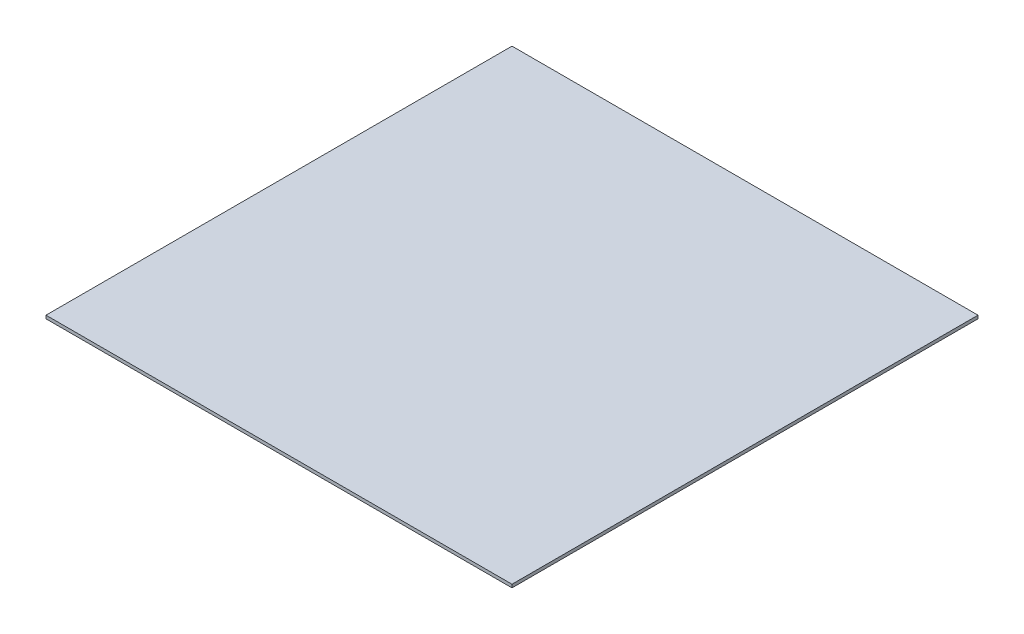
ISO-10303-21;
HEADER;
FILE_DESCRIPTION(('STEP AP214'),'2;1');
FILE_NAME('part.step','',(''),(''),'','','');
FILE_SCHEMA(('AUTOMOTIVE_DESIGN { 1 0 10303 214 1 1 1 1 }'));
ENDSEC;
DATA;
#1=APPLICATION_CONTEXT('core data for automotive mechanical design processes');
#2=APPLICATION_PROTOCOL_DEFINITION('international standard','automotive_design',2000,#1);
#3=PRODUCT_CONTEXT('',#1,'mechanical');
#4=PRODUCT('Part','Part','',(#3));
#5=PRODUCT_RELATED_PRODUCT_CATEGORY('part','',(#4));
#6=PRODUCT_DEFINITION_FORMATION('','',#4);
#7=PRODUCT_DEFINITION_CONTEXT('part definition',#1,'design');
#8=PRODUCT_DEFINITION('design','',#6,#7);
#9=PRODUCT_DEFINITION_SHAPE('','',#8);
#10=(LENGTH_UNIT() NAMED_UNIT(*) SI_UNIT(.MILLI.,.METRE.));
#11=(NAMED_UNIT(*) PLANE_ANGLE_UNIT() SI_UNIT($,.RADIAN.));
#12=(NAMED_UNIT(*) SI_UNIT($,.STERADIAN.) SOLID_ANGLE_UNIT());
#13=UNCERTAINTY_MEASURE_WITH_UNIT(LENGTH_MEASURE(1.E-05),#10,'distance_accuracy_value','');
#14=(GEOMETRIC_REPRESENTATION_CONTEXT(3) GLOBAL_UNCERTAINTY_ASSIGNED_CONTEXT((#13)) GLOBAL_UNIT_ASSIGNED_CONTEXT((#10,
#11,#12)) REPRESENTATION_CONTEXT('',''));
#15=CARTESIAN_POINT('',(0.,0.,0.));
#16=DIRECTION('',(0.,0.,1.));
#17=DIRECTION('',(1.,0.,0.));
#18=AXIS2_PLACEMENT_3D('',#15,#16,#17);
#19=CARTESIAN_POINT('',(11.,0.15,11.));
#20=DIRECTION('',(-1.,0.,0.));
#21=DIRECTION('',(0.,0.,1.));
#22=AXIS2_PLACEMENT_3D('',#19,#20,#21);
#23=PLANE('',#22);
#24=DIRECTION('',(0.,0.,-1.));
#25=VECTOR('',#24,1.);
#26=CARTESIAN_POINT('',(11.,0.,11.));
#27=LINE('',#26,#25);
#28=CARTESIAN_POINT('',(11.,0.,11.));
#29=VERTEX_POINT('',#28);
#30=CARTESIAN_POINT('',(11.,0.,-11.));
#31=VERTEX_POINT('',#30);
#32=EDGE_CURVE('E95',#29,#31,#27,.T.);
#33=ORIENTED_EDGE('',*,*,#32,.T.);
#34=DIRECTION('',(0.,-1.,0.));
#35=VECTOR('',#34,1.);
#36=CARTESIAN_POINT('',(11.,0.15,-11.));
#37=LINE('',#36,#35);
#38=CARTESIAN_POINT('',(11.,0.15,-11.));
#39=VERTEX_POINT('',#38);
#40=EDGE_CURVE('E11',#39,#31,#37,.T.);
#41=ORIENTED_EDGE('',*,*,#40,.F.);
#42=DIRECTION('',(0.,0.,-1.));
#43=VECTOR('',#42,1.);
#44=CARTESIAN_POINT('',(11.,0.15,11.));
#45=LINE('',#44,#43);
#46=CARTESIAN_POINT('',(11.,0.15,11.));
#47=VERTEX_POINT('',#46);
#48=EDGE_CURVE('E83',#47,#39,#45,.T.);
#49=ORIENTED_EDGE('',*,*,#48,.F.);
#50=DIRECTION('',(0.,-1.,0.));
#51=VECTOR('',#50,1.);
#52=CARTESIAN_POINT('',(11.,0.15,11.));
#53=LINE('',#52,#51);
#54=EDGE_CURVE('E91',#47,#29,#53,.T.);
#55=ORIENTED_EDGE('',*,*,#54,.T.);
#56=EDGE_LOOP('',(#33,#41,#49,#55));
#57=FACE_BOUND('',#56,.T.);
#58=ADVANCED_FACE('F32',(#57),#23,.F.);
#59=CARTESIAN_POINT('',(-11.,0.15,-11.));
#60=DIRECTION('',(0.,0.,1.));
#61=DIRECTION('',(1.,0.,0.));
#62=AXIS2_PLACEMENT_3D('',#59,#60,#61);
#63=PLANE('',#62);
#64=DIRECTION('',(-1.,0.,0.));
#65=VECTOR('',#64,1.);
#66=CARTESIAN_POINT('',(-11.,0.,-11.));
#67=LINE('',#66,#65);
#68=CARTESIAN_POINT('',(-11.,0.,-11.));
#69=VERTEX_POINT('',#68);
#70=EDGE_CURVE('E87',#31,#69,#67,.T.);
#71=ORIENTED_EDGE('',*,*,#70,.T.);
#72=DIRECTION('',(0.,-1.,0.));
#73=VECTOR('',#72,1.);
#74=CARTESIAN_POINT('',(-11.,0.15,-11.));
#75=LINE('',#74,#73);
#76=CARTESIAN_POINT('',(-11.,0.15,-11.));
#77=VERTEX_POINT('',#76);
#78=EDGE_CURVE('E40',#77,#69,#75,.T.);
#79=ORIENTED_EDGE('',*,*,#78,.F.);
#80=DIRECTION('',(-1.,0.,0.));
#81=VECTOR('',#80,1.);
#82=CARTESIAN_POINT('',(-11.,0.15,-11.));
#83=LINE('',#82,#81);
#84=EDGE_CURVE('E78',#39,#77,#83,.T.);
#85=ORIENTED_EDGE('',*,*,#84,.F.);
#86=ORIENTED_EDGE('',*,*,#40,.T.);
#87=EDGE_LOOP('',(#71,#79,#85,#86));
#88=FACE_BOUND('',#87,.T.);
#89=ADVANCED_FACE('F86',(#88),#63,.F.);
#90=CARTESIAN_POINT('',(-11.,0.15,11.));
#91=DIRECTION('',(1.,0.,0.));
#92=DIRECTION('',(0.,0.,-1.));
#93=AXIS2_PLACEMENT_3D('',#90,#91,#92);
#94=PLANE('',#93);
#95=DIRECTION('',(0.,0.,1.));
#96=VECTOR('',#95,1.);
#97=CARTESIAN_POINT('',(-11.,0.,11.));
#98=LINE('',#97,#96);
#99=CARTESIAN_POINT('',(-11.,0.,11.));
#100=VERTEX_POINT('',#99);
#101=EDGE_CURVE('E65',#69,#100,#98,.T.);
#102=ORIENTED_EDGE('',*,*,#101,.T.);
#103=DIRECTION('',(0.,-1.,0.));
#104=VECTOR('',#103,1.);
#105=CARTESIAN_POINT('',(-11.,0.15,11.));
#106=LINE('',#105,#104);
#107=CARTESIAN_POINT('',(-11.,0.15,11.));
#108=VERTEX_POINT('',#107);
#109=EDGE_CURVE('E88',#108,#100,#106,.T.);
#110=ORIENTED_EDGE('',*,*,#109,.F.);
#111=DIRECTION('',(0.,0.,1.));
#112=VECTOR('',#111,1.);
#113=CARTESIAN_POINT('',(-11.,0.15,11.));
#114=LINE('',#113,#112);
#115=EDGE_CURVE('E81',#77,#108,#114,.T.);
#116=ORIENTED_EDGE('',*,*,#115,.F.);
#117=ORIENTED_EDGE('',*,*,#78,.T.);
#118=EDGE_LOOP('',(#102,#110,#116,#117));
#119=FACE_BOUND('',#118,.T.);
#120=ADVANCED_FACE('F89',(#119),#94,.F.);
#121=CARTESIAN_POINT('',(-11.,0.15,11.));
#122=DIRECTION('',(0.,0.,-1.));
#123=DIRECTION('',(-1.,0.,0.));
#124=AXIS2_PLACEMENT_3D('',#121,#122,#123);
#125=PLANE('',#124);
#126=DIRECTION('',(1.,0.,0.));
#127=VECTOR('',#126,1.);
#128=CARTESIAN_POINT('',(-11.,0.,11.));
#129=LINE('',#128,#127);
#130=EDGE_CURVE('E71',#100,#29,#129,.T.);
#131=ORIENTED_EDGE('',*,*,#130,.T.);
#132=ORIENTED_EDGE('',*,*,#54,.F.);
#133=DIRECTION('',(1.,0.,0.));
#134=VECTOR('',#133,1.);
#135=CARTESIAN_POINT('',(-11.,0.15,11.));
#136=LINE('',#135,#134);
#137=EDGE_CURVE('E48',#108,#47,#136,.T.);
#138=ORIENTED_EDGE('',*,*,#137,.F.);
#139=ORIENTED_EDGE('',*,*,#109,.T.);
#140=EDGE_LOOP('',(#131,#132,#138,#139));
#141=FACE_BOUND('',#140,.T.);
#142=ADVANCED_FACE('F102',(#141),#125,.F.);
#143=CARTESIAN_POINT('',(0.,0.15,0.));
#144=DIRECTION('',(0.,-1.,0.));
#145=DIRECTION('',(0.,0.,-1.));
#146=AXIS2_PLACEMENT_3D('',#143,#144,#145);
#147=PLANE('',#146);
#148=ORIENTED_EDGE('',*,*,#48,.T.);
#149=ORIENTED_EDGE('',*,*,#84,.T.);
#150=ORIENTED_EDGE('',*,*,#115,.T.);
#151=ORIENTED_EDGE('',*,*,#137,.T.);
#152=EDGE_LOOP('',(#148,#149,#150,#151));
#153=FACE_BOUND('',#152,.T.);
#154=ADVANCED_FACE('F79',(#153),#147,.F.);
#155=CARTESIAN_POINT('',(0.,0.,0.));
#156=DIRECTION('',(0.,-1.,0.));
#157=DIRECTION('',(0.,0.,-1.));
#158=AXIS2_PLACEMENT_3D('',#155,#156,#157);
#159=PLANE('',#158);
#160=ORIENTED_EDGE('',*,*,#32,.F.);
#161=ORIENTED_EDGE('',*,*,#130,.F.);
#162=ORIENTED_EDGE('',*,*,#101,.F.);
#163=ORIENTED_EDGE('',*,*,#70,.F.);
#164=EDGE_LOOP('',(#160,#161,#162,#163));
#165=FACE_BOUND('',#164,.T.);
#166=ADVANCED_FACE('F105',(#165),#159,.T.);
#167=CLOSED_SHELL('',(#58,#89,#120,#142,#154,#166));
#168=MANIFOLD_SOLID_BREP('B2',#167);
#169=ADVANCED_BREP_SHAPE_REPRESENTATION('',(#18,#168),#14);
#170=SHAPE_DEFINITION_REPRESENTATION(#9,#169);
ENDSEC;
END-ISO-10303-21;
